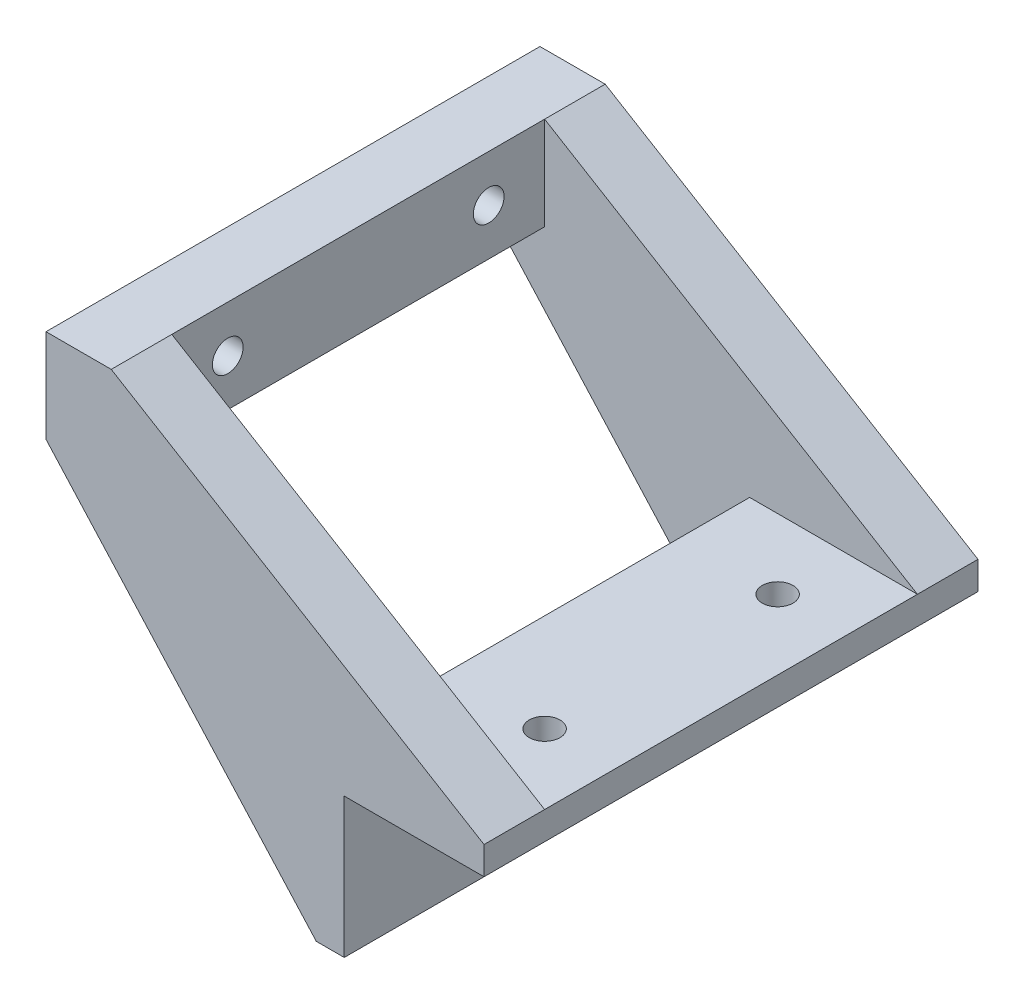
ISO-10303-21;
HEADER;
FILE_DESCRIPTION(('STEP AP214'),'2;1');
FILE_NAME('part.step','',(''),(''),'','','');
FILE_SCHEMA(('AUTOMOTIVE_DESIGN { 1 0 10303 214 1 1 1 1 }'));
ENDSEC;
DATA;
#1=APPLICATION_CONTEXT('core data for automotive mechanical design processes');
#2=APPLICATION_PROTOCOL_DEFINITION('international standard','automotive_design',2000,#1);
#3=PRODUCT_CONTEXT('',#1,'mechanical');
#4=PRODUCT('Part','Part','',(#3));
#5=PRODUCT_RELATED_PRODUCT_CATEGORY('part','',(#4));
#6=PRODUCT_DEFINITION_FORMATION('','',#4);
#7=PRODUCT_DEFINITION_CONTEXT('part definition',#1,'design');
#8=PRODUCT_DEFINITION('design','',#6,#7);
#9=PRODUCT_DEFINITION_SHAPE('','',#8);
#10=(LENGTH_UNIT() NAMED_UNIT(*) SI_UNIT(.MILLI.,.METRE.));
#11=(NAMED_UNIT(*) PLANE_ANGLE_UNIT() SI_UNIT($,.RADIAN.));
#12=(NAMED_UNIT(*) SI_UNIT($,.STERADIAN.) SOLID_ANGLE_UNIT());
#13=UNCERTAINTY_MEASURE_WITH_UNIT(LENGTH_MEASURE(1.E-05),#10,'distance_accuracy_value','');
#14=(GEOMETRIC_REPRESENTATION_CONTEXT(3) GLOBAL_UNCERTAINTY_ASSIGNED_CONTEXT((#13)) GLOBAL_UNIT_ASSIGNED_CONTEXT((#10,
#11,#12)) REPRESENTATION_CONTEXT('',''));
#15=CARTESIAN_POINT('',(0.,0.,0.));
#16=DIRECTION('',(0.,0.,1.));
#17=DIRECTION('',(1.,0.,0.));
#18=AXIS2_PLACEMENT_3D('',#15,#16,#17);
#19=CARTESIAN_POINT('',(-25.,17.15,26.5));
#20=DIRECTION('',(1.,0.,0.));
#21=DIRECTION('',(0.,1.,0.));
#22=AXIS2_PLACEMENT_3D('',#19,#20,#21);
#23=PLANE('',#22);
#24=CARTESIAN_POINT('',(-25.,22.15,14.));
#25=DIRECTION('',(-1.,0.,0.));
#26=DIRECTION('',(0.,-1.,0.));
#27=AXIS2_PLACEMENT_3D('',#24,#25,#26);
#28=CIRCLE('',#27,1.65);
#29=CARTESIAN_POINT('',(-25.,20.5,14.));
#30=VERTEX_POINT('',#29);
#31=EDGE_CURVE('E221',#30,#30,#28,.T.);
#32=ORIENTED_EDGE('',*,*,#31,.T.);
#33=EDGE_LOOP('',(#32));
#34=FACE_BOUND('',#33,.T.);
#35=CARTESIAN_POINT('',(-25.,22.15,-14.));
#36=DIRECTION('',(-1.,0.,0.));
#37=DIRECTION('',(0.,-1.,0.));
#38=AXIS2_PLACEMENT_3D('',#35,#36,#37);
#39=CIRCLE('',#38,1.65);
#40=CARTESIAN_POINT('',(-25.,20.5,-14.));
#41=VERTEX_POINT('',#40);
#42=EDGE_CURVE('E224',#41,#41,#39,.T.);
#43=ORIENTED_EDGE('',*,*,#42,.T.);
#44=EDGE_LOOP('',(#43));
#45=FACE_BOUND('',#44,.T.);
#46=DIRECTION('',(0.,1.,0.));
#47=VECTOR('',#46,1.);
#48=CARTESIAN_POINT('',(-25.,3.00000000000002,20.));
#49=LINE('',#48,#47);
#50=CARTESIAN_POINT('',(-25.,17.15,20.));
#51=VERTEX_POINT('',#50);
#52=CARTESIAN_POINT('',(-25.,27.15,20.));
#53=VERTEX_POINT('',#52);
#54=EDGE_CURVE('E237',#51,#53,#49,.T.);
#55=ORIENTED_EDGE('',*,*,#54,.F.);
#56=DIRECTION('',(0.,0.,-1.));
#57=VECTOR('',#56,1.);
#58=CARTESIAN_POINT('',(-25.,17.15,26.5));
#59=LINE('',#58,#57);
#60=CARTESIAN_POINT('',(-25.,17.15,-20.));
#61=VERTEX_POINT('',#60);
#62=EDGE_CURVE('E11',#51,#61,#59,.T.);
#63=ORIENTED_EDGE('',*,*,#62,.T.);
#64=DIRECTION('',(0.,-1.,0.));
#65=VECTOR('',#64,1.);
#66=CARTESIAN_POINT('',(-25.,3.00000000000002,-20.));
#67=LINE('',#66,#65);
#68=CARTESIAN_POINT('',(-25.,27.15,-20.));
#69=VERTEX_POINT('',#68);
#70=EDGE_CURVE('E149',#69,#61,#67,.T.);
#71=ORIENTED_EDGE('',*,*,#70,.F.);
#72=DIRECTION('',(0.,0.,-1.));
#73=VECTOR('',#72,1.);
#74=CARTESIAN_POINT('',(-25.,27.15,20.));
#75=LINE('',#74,#73);
#76=EDGE_CURVE('E243',#53,#69,#75,.T.);
#77=ORIENTED_EDGE('',*,*,#76,.F.);
#78=EDGE_LOOP('',(#55,#63,#71,#77));
#79=FACE_BOUND('',#78,.T.);
#80=ADVANCED_FACE('F38',(#34,#45,#79),#23,.T.);
#81=CARTESIAN_POINT('',(-25.,27.15,26.5));
#82=DIRECTION('',(-0.51685430248884,-0.856073378863503,0.));
#83=DIRECTION('',(0.856073378863503,-0.51685430248884,0.));
#84=AXIS2_PLACEMENT_3D('',#81,#82,#83);
#85=PLANE('',#84);
#86=DIRECTION('',(0.,0.,-1.));
#87=VECTOR('',#86,1.);
#88=CARTESIAN_POINT('',(15.,3.,26.5));
#89=LINE('',#88,#87);
#90=CARTESIAN_POINT('',(15.,3.,26.5));
#91=VERTEX_POINT('',#90);
#92=CARTESIAN_POINT('',(15.,3.,20.));
#93=VERTEX_POINT('',#92);
#94=EDGE_CURVE('E156',#91,#93,#89,.T.);
#95=ORIENTED_EDGE('',*,*,#94,.T.);
#96=DIRECTION('',(-0.856073378863503,0.51685430248884,0.));
#97=VECTOR('',#96,1.);
#98=CARTESIAN_POINT('',(-25.,27.15,20.));
#99=LINE('',#98,#97);
#100=EDGE_CURVE('E233',#93,#53,#99,.T.);
#101=ORIENTED_EDGE('',*,*,#100,.T.);
#102=DIRECTION('',(0.,0.,-1.));
#103=VECTOR('',#102,1.);
#104=CARTESIAN_POINT('',(-25.,27.15,26.5));
#105=LINE('',#104,#103);
#106=CARTESIAN_POINT('',(-25.,27.15,26.5));
#107=VERTEX_POINT('',#106);
#108=EDGE_CURVE('E162',#107,#53,#105,.T.);
#109=ORIENTED_EDGE('',*,*,#108,.F.);
#110=DIRECTION('',(-0.856073378863503,0.51685430248884,0.));
#111=VECTOR('',#110,1.);
#112=CARTESIAN_POINT('',(-25.,27.15,26.5));
#113=LINE('',#112,#111);
#114=EDGE_CURVE('E204',#91,#107,#113,.T.);
#115=ORIENTED_EDGE('',*,*,#114,.F.);
#116=EDGE_LOOP('',(#95,#101,#109,#115));
#117=FACE_BOUND('',#116,.T.);
#118=ADVANCED_FACE('F318',(#117),#85,.F.);
#119=CARTESIAN_POINT('',(15.,3.,26.5));
#120=DIRECTION('',(-1.,0.,0.));
#121=DIRECTION('',(0.,0.,1.));
#122=AXIS2_PLACEMENT_3D('',#119,#120,#121);
#123=PLANE('',#122);
#124=DIRECTION('',(0.,1.,0.));
#125=VECTOR('',#124,1.);
#126=CARTESIAN_POINT('',(15.,3.,-26.5));
#127=LINE('',#126,#125);
#128=CARTESIAN_POINT('',(15.,0.,-26.5));
#129=VERTEX_POINT('',#128);
#130=CARTESIAN_POINT('',(15.,3.,-26.5));
#131=VERTEX_POINT('',#130);
#132=EDGE_CURVE('E193',#129,#131,#127,.T.);
#133=ORIENTED_EDGE('',*,*,#132,.T.);
#134=CARTESIAN_POINT('',(15.,3.,-20.));
#135=VERTEX_POINT('',#134);
#136=EDGE_CURVE('E159',#135,#131,#89,.T.);
#137=ORIENTED_EDGE('',*,*,#136,.F.);
#138=DIRECTION('',(0.,0.,-1.));
#139=VECTOR('',#138,1.);
#140=CARTESIAN_POINT('',(15.,3.,-20.));
#141=LINE('',#140,#139);
#142=EDGE_CURVE('E241',#93,#135,#141,.T.);
#143=ORIENTED_EDGE('',*,*,#142,.F.);
#144=ORIENTED_EDGE('',*,*,#94,.F.);
#145=DIRECTION('',(0.,1.,0.));
#146=VECTOR('',#145,1.);
#147=CARTESIAN_POINT('',(15.,3.,26.5));
#148=LINE('',#147,#146);
#149=CARTESIAN_POINT('',(15.,0.,26.5));
#150=VERTEX_POINT('',#149);
#151=EDGE_CURVE('E183',#150,#91,#148,.T.);
#152=ORIENTED_EDGE('',*,*,#151,.F.);
#153=DIRECTION('',(0.,0.,-1.));
#154=VECTOR('',#153,1.);
#155=CARTESIAN_POINT('',(15.,0.,26.5));
#156=LINE('',#155,#154);
#157=EDGE_CURVE('E177',#150,#129,#156,.T.);
#158=ORIENTED_EDGE('',*,*,#157,.T.);
#159=EDGE_LOOP('',(#133,#137,#143,#144,#152,#158));
#160=FACE_BOUND('',#159,.T.);
#161=ADVANCED_FACE('F40',(#160),#123,.F.);
#162=CARTESIAN_POINT('',(-25.,27.15,-26.5));
#163=VERTEX_POINT('',#162);
#164=EDGE_CURVE('E165',#69,#163,#105,.T.);
#165=ORIENTED_EDGE('',*,*,#164,.F.);
#166=DIRECTION('',(0.856073378863503,-0.51685430248884,0.));
#167=VECTOR('',#166,1.);
#168=CARTESIAN_POINT('',(-25.,27.15,-20.));
#169=LINE('',#168,#167);
#170=EDGE_CURVE('E230',#69,#135,#169,.T.);
#171=ORIENTED_EDGE('',*,*,#170,.T.);
#172=ORIENTED_EDGE('',*,*,#136,.T.);
#173=DIRECTION('',(-0.856073378863503,0.51685430248884,0.));
#174=VECTOR('',#173,1.);
#175=CARTESIAN_POINT('',(-25.,27.15,-26.5));
#176=LINE('',#175,#174);
#177=EDGE_CURVE('E190',#131,#163,#176,.T.);
#178=ORIENTED_EDGE('',*,*,#177,.T.);
#179=EDGE_LOOP('',(#165,#171,#172,#178));
#180=FACE_BOUND('',#179,.T.);
#181=ADVANCED_FACE('F313',(#180),#85,.F.);
#182=CARTESIAN_POINT('',(-32.,17.15,26.5));
#183=DIRECTION('',(0.742547199692077,0.669793741557395,0.));
#184=DIRECTION('',(-0.669793741557395,0.742547199692077,0.));
#185=AXIS2_PLACEMENT_3D('',#182,#183,#184);
#186=PLANE('',#185);
#187=DIRECTION('',(0.,0.,-1.));
#188=VECTOR('',#187,1.);
#189=CARTESIAN_POINT('',(-3.,-15.,26.5));
#190=LINE('',#189,#188);
#191=CARTESIAN_POINT('',(-2.99999999999999,-15.,-20.));
#192=VERTEX_POINT('',#191);
#193=CARTESIAN_POINT('',(-3.,-15.,-26.5));
#194=VERTEX_POINT('',#193);
#195=EDGE_CURVE('E154',#192,#194,#190,.T.);
#196=ORIENTED_EDGE('',*,*,#195,.F.);
#197=DIRECTION('',(-0.669793741557395,0.742547199692077,0.));
#198=VECTOR('',#197,1.);
#199=CARTESIAN_POINT('',(-32.,17.15,-20.));
#200=LINE('',#199,#198);
#201=CARTESIAN_POINT('',(-28.8596344063938,13.6685257298469,-20.));
#202=VERTEX_POINT('',#201);
#203=EDGE_CURVE('E147',#192,#202,#200,.T.);
#204=ORIENTED_EDGE('',*,*,#203,.T.);
#205=DIRECTION('',(0.,0.,1.));
#206=VECTOR('',#205,1.);
#207=CARTESIAN_POINT('',(-28.8596344063938,13.6685257298469,-20.));
#208=LINE('',#207,#206);
#209=CARTESIAN_POINT('',(-28.8596344063938,13.6685257298469,20.));
#210=VERTEX_POINT('',#209);
#211=EDGE_CURVE('E137',#202,#210,#208,.T.);
#212=ORIENTED_EDGE('',*,*,#211,.T.);
#213=DIRECTION('',(0.669793741557395,-0.742547199692077,0.));
#214=VECTOR('',#213,1.);
#215=CARTESIAN_POINT('',(-32.,17.15,20.));
#216=LINE('',#215,#214);
#217=CARTESIAN_POINT('',(-3.,-15.,20.));
#218=VERTEX_POINT('',#217);
#219=EDGE_CURVE('E46',#210,#218,#216,.T.);
#220=ORIENTED_EDGE('',*,*,#219,.T.);
#221=CARTESIAN_POINT('',(-3.,-15.,26.5));
#222=VERTEX_POINT('',#221);
#223=EDGE_CURVE('E168',#222,#218,#190,.T.);
#224=ORIENTED_EDGE('',*,*,#223,.F.);
#225=DIRECTION('',(0.669793741557395,-0.742547199692077,0.));
#226=VECTOR('',#225,1.);
#227=CARTESIAN_POINT('',(-32.,17.15,26.5));
#228=LINE('',#227,#226);
#229=CARTESIAN_POINT('',(-32.,17.15,26.5));
#230=VERTEX_POINT('',#229);
#231=EDGE_CURVE('E202',#230,#222,#228,.T.);
#232=ORIENTED_EDGE('',*,*,#231,.F.);
#233=DIRECTION('',(0.,0.,-1.));
#234=VECTOR('',#233,1.);
#235=CARTESIAN_POINT('',(-32.,17.15,26.5));
#236=LINE('',#235,#234);
#237=CARTESIAN_POINT('',(-32.,17.15,-26.5));
#238=VERTEX_POINT('',#237);
#239=EDGE_CURVE('E166',#230,#238,#236,.T.);
#240=ORIENTED_EDGE('',*,*,#239,.T.);
#241=DIRECTION('',(0.669793741557395,-0.742547199692077,0.));
#242=VECTOR('',#241,1.);
#243=CARTESIAN_POINT('',(-32.,17.15,-26.5));
#244=LINE('',#243,#242);
#245=EDGE_CURVE('E188',#238,#194,#244,.T.);
#246=ORIENTED_EDGE('',*,*,#245,.T.);
#247=EDGE_LOOP('',(#196,#204,#212,#220,#224,#232,#240,#246));
#248=FACE_BOUND('',#247,.T.);
#249=ADVANCED_FACE('F152',(#248),#186,.F.);
#250=CARTESIAN_POINT('',(0.,-15.,26.5));
#251=DIRECTION('',(0.,1.,0.));
#252=DIRECTION('',(0.,0.,1.));
#253=AXIS2_PLACEMENT_3D('',#250,#251,#252);
#254=PLANE('',#253);
#255=DIRECTION('',(1.,0.,0.));
#256=VECTOR('',#255,1.);
#257=CARTESIAN_POINT('',(0.,-15.,-26.5));
#258=LINE('',#257,#256);
#259=CARTESIAN_POINT('',(0.,-15.,-26.5));
#260=VERTEX_POINT('',#259);
#261=EDGE_CURVE('E186',#194,#260,#258,.T.);
#262=ORIENTED_EDGE('',*,*,#261,.T.);
#263=DIRECTION('',(0.,0.,-1.));
#264=VECTOR('',#263,1.);
#265=CARTESIAN_POINT('',(0.,-15.,26.5));
#266=LINE('',#265,#264);
#267=CARTESIAN_POINT('',(0.,-15.,26.5));
#268=VERTEX_POINT('',#267);
#269=EDGE_CURVE('E171',#268,#260,#266,.T.);
#270=ORIENTED_EDGE('',*,*,#269,.F.);
#271=DIRECTION('',(1.,0.,0.));
#272=VECTOR('',#271,1.);
#273=CARTESIAN_POINT('',(0.,-15.,26.5));
#274=LINE('',#273,#272);
#275=EDGE_CURVE('E200',#222,#268,#274,.T.);
#276=ORIENTED_EDGE('',*,*,#275,.F.);
#277=ORIENTED_EDGE('',*,*,#223,.T.);
#278=DIRECTION('',(0.,0.,1.));
#279=VECTOR('',#278,1.);
#280=CARTESIAN_POINT('',(-3.,-15.,20.));
#281=LINE('',#280,#279);
#282=EDGE_CURVE('E255',#192,#218,#281,.T.);
#283=ORIENTED_EDGE('',*,*,#282,.F.);
#284=ORIENTED_EDGE('',*,*,#195,.T.);
#285=EDGE_LOOP('',(#262,#270,#276,#277,#283,#284));
#286=FACE_BOUND('',#285,.T.);
#287=ADVANCED_FACE('F330',(#286),#254,.F.);
#288=CARTESIAN_POINT('',(0.,0.,26.5));
#289=DIRECTION('',(-1.,0.,0.));
#290=DIRECTION('',(0.,-1.,0.));
#291=AXIS2_PLACEMENT_3D('',#288,#289,#290);
#292=PLANE('',#291);
#293=CARTESIAN_POINT('',(0.,-7.5,5.));
#294=DIRECTION('',(1.,0.,0.));
#295=DIRECTION('',(0.,1.,0.));
#296=AXIS2_PLACEMENT_3D('',#293,#294,#295);
#297=CIRCLE('',#296,1.65);
#298=CARTESIAN_POINT('',(0.,-5.85,5.));
#299=VERTEX_POINT('',#298);
#300=EDGE_CURVE('E264',#299,#299,#297,.T.);
#301=ORIENTED_EDGE('',*,*,#300,.F.);
#302=EDGE_LOOP('',(#301));
#303=FACE_BOUND('',#302,.T.);
#304=CARTESIAN_POINT('',(0.,-7.5,-5.));
#305=DIRECTION('',(1.,0.,0.));
#306=DIRECTION('',(0.,1.,0.));
#307=AXIS2_PLACEMENT_3D('',#304,#305,#306);
#308=CIRCLE('',#307,1.65);
#309=CARTESIAN_POINT('',(0.,-5.85,-5.));
#310=VERTEX_POINT('',#309);
#311=EDGE_CURVE('E265',#310,#310,#308,.T.);
#312=ORIENTED_EDGE('',*,*,#311,.F.);
#313=EDGE_LOOP('',(#312));
#314=FACE_BOUND('',#313,.T.);
#315=DIRECTION('',(0.,1.,0.));
#316=VECTOR('',#315,1.);
#317=CARTESIAN_POINT('',(0.,0.,-26.5));
#318=LINE('',#317,#316);
#319=CARTESIAN_POINT('',(0.,0.,-26.5));
#320=VERTEX_POINT('',#319);
#321=EDGE_CURVE('E184',#260,#320,#318,.T.);
#322=ORIENTED_EDGE('',*,*,#321,.T.);
#323=DIRECTION('',(0.,0.,-1.));
#324=VECTOR('',#323,1.);
#325=CARTESIAN_POINT('',(0.,0.,26.5));
#326=LINE('',#325,#324);
#327=CARTESIAN_POINT('',(0.,0.,26.5));
#328=VERTEX_POINT('',#327);
#329=EDGE_CURVE('E174',#328,#320,#326,.T.);
#330=ORIENTED_EDGE('',*,*,#329,.F.);
#331=DIRECTION('',(0.,1.,0.));
#332=VECTOR('',#331,1.);
#333=CARTESIAN_POINT('',(0.,0.,26.5));
#334=LINE('',#333,#332);
#335=EDGE_CURVE('E198',#268,#328,#334,.T.);
#336=ORIENTED_EDGE('',*,*,#335,.F.);
#337=ORIENTED_EDGE('',*,*,#269,.T.);
#338=EDGE_LOOP('',(#322,#330,#336,#337));
#339=FACE_BOUND('',#338,.T.);
#340=ADVANCED_FACE('F292',(#303,#314,#339),#292,.F.);
#341=CARTESIAN_POINT('',(15.,0.,26.5));
#342=DIRECTION('',(0.,1.,0.));
#343=DIRECTION('',(-1.,0.,0.));
#344=AXIS2_PLACEMENT_3D('',#341,#342,#343);
#345=PLANE('',#344);
#346=CARTESIAN_POINT('',(7.5,0.,12.5));
#347=DIRECTION('',(0.,-1.,0.));
#348=DIRECTION('',(1.,0.,0.));
#349=AXIS2_PLACEMENT_3D('',#346,#347,#348);
#350=CIRCLE('',#349,1.65);
#351=CARTESIAN_POINT('',(9.15,0.,12.5));
#352=VERTEX_POINT('',#351);
#353=EDGE_CURVE('E276',#352,#352,#350,.T.);
#354=ORIENTED_EDGE('',*,*,#353,.F.);
#355=EDGE_LOOP('',(#354));
#356=FACE_BOUND('',#355,.T.);
#357=CARTESIAN_POINT('',(7.5,0.,-12.5));
#358=DIRECTION('',(0.,-1.,0.));
#359=DIRECTION('',(1.,0.,0.));
#360=AXIS2_PLACEMENT_3D('',#357,#358,#359);
#361=CIRCLE('',#360,1.65);
#362=CARTESIAN_POINT('',(9.15,0.,-12.5));
#363=VERTEX_POINT('',#362);
#364=EDGE_CURVE('E277',#363,#363,#361,.T.);
#365=ORIENTED_EDGE('',*,*,#364,.F.);
#366=EDGE_LOOP('',(#365));
#367=FACE_BOUND('',#366,.T.);
#368=DIRECTION('',(1.,0.,0.));
#369=VECTOR('',#368,1.);
#370=CARTESIAN_POINT('',(15.,0.,-26.5));
#371=LINE('',#370,#369);
#372=EDGE_CURVE('E181',#320,#129,#371,.T.);
#373=ORIENTED_EDGE('',*,*,#372,.T.);
#374=ORIENTED_EDGE('',*,*,#157,.F.);
#375=DIRECTION('',(1.,0.,0.));
#376=VECTOR('',#375,1.);
#377=CARTESIAN_POINT('',(15.,0.,26.5));
#378=LINE('',#377,#376);
#379=EDGE_CURVE('E180',#328,#150,#378,.T.);
#380=ORIENTED_EDGE('',*,*,#379,.F.);
#381=ORIENTED_EDGE('',*,*,#329,.T.);
#382=EDGE_LOOP('',(#373,#374,#380,#381));
#383=FACE_BOUND('',#382,.T.);
#384=ADVANCED_FACE('F288',(#356,#367,#383),#345,.F.);
#385=CARTESIAN_POINT('',(0.,0.,26.5));
#386=DIRECTION('',(0.,0.,-1.));
#387=DIRECTION('',(-1.,0.,0.));
#388=AXIS2_PLACEMENT_3D('',#385,#386,#387);
#389=PLANE('',#388);
#390=ORIENTED_EDGE('',*,*,#151,.T.);
#391=ORIENTED_EDGE('',*,*,#114,.T.);
#392=DIRECTION('',(1.,0.,0.));
#393=VECTOR('',#392,1.);
#394=CARTESIAN_POINT('',(-32.,27.15,26.5));
#395=LINE('',#394,#393);
#396=CARTESIAN_POINT('',(-32.,27.15,26.5));
#397=VERTEX_POINT('',#396);
#398=EDGE_CURVE('E196',#397,#107,#395,.T.);
#399=ORIENTED_EDGE('',*,*,#398,.F.);
#400=DIRECTION('',(0.,1.,0.));
#401=VECTOR('',#400,1.);
#402=CARTESIAN_POINT('',(-32.,27.15,26.5));
#403=LINE('',#402,#401);
#404=EDGE_CURVE('E215',#230,#397,#403,.T.);
#405=ORIENTED_EDGE('',*,*,#404,.F.);
#406=ORIENTED_EDGE('',*,*,#231,.T.);
#407=ORIENTED_EDGE('',*,*,#275,.T.);
#408=ORIENTED_EDGE('',*,*,#335,.T.);
#409=ORIENTED_EDGE('',*,*,#379,.T.);
#410=EDGE_LOOP('',(#390,#391,#399,#405,#406,#407,#408,#409));
#411=FACE_BOUND('',#410,.T.);
#412=ADVANCED_FACE('F291',(#411),#389,.F.);
#413=CARTESIAN_POINT('',(0.,0.,-26.5));
#414=DIRECTION('',(0.,0.,-1.));
#415=DIRECTION('',(-1.,0.,0.));
#416=AXIS2_PLACEMENT_3D('',#413,#414,#415);
#417=PLANE('',#416);
#418=ORIENTED_EDGE('',*,*,#132,.F.);
#419=ORIENTED_EDGE('',*,*,#372,.F.);
#420=ORIENTED_EDGE('',*,*,#321,.F.);
#421=ORIENTED_EDGE('',*,*,#261,.F.);
#422=ORIENTED_EDGE('',*,*,#245,.F.);
#423=DIRECTION('',(0.,-1.,0.));
#424=VECTOR('',#423,1.);
#425=CARTESIAN_POINT('',(-32.,27.15,-26.5));
#426=LINE('',#425,#424);
#427=CARTESIAN_POINT('',(-32.,27.15,-26.5));
#428=VERTEX_POINT('',#427);
#429=EDGE_CURVE('E217',#428,#238,#426,.T.);
#430=ORIENTED_EDGE('',*,*,#429,.F.);
#431=DIRECTION('',(1.,0.,0.));
#432=VECTOR('',#431,1.);
#433=CARTESIAN_POINT('',(-32.,27.15,-26.5));
#434=LINE('',#433,#432);
#435=EDGE_CURVE('E210',#428,#163,#434,.T.);
#436=ORIENTED_EDGE('',*,*,#435,.T.);
#437=ORIENTED_EDGE('',*,*,#177,.F.);
#438=EDGE_LOOP('',(#418,#419,#420,#421,#422,#430,#436,#437));
#439=FACE_BOUND('',#438,.T.);
#440=ADVANCED_FACE('F308',(#439),#417,.T.);
#441=CARTESIAN_POINT('',(-32.,0.,0.));
#442=DIRECTION('',(-1.,0.,0.));
#443=DIRECTION('',(0.,-1.,0.));
#444=AXIS2_PLACEMENT_3D('',#441,#442,#443);
#445=PLANE('',#444);
#446=CARTESIAN_POINT('',(-32.,22.15,14.));
#447=DIRECTION('',(-1.,0.,0.));
#448=DIRECTION('',(0.,-1.,0.));
#449=AXIS2_PLACEMENT_3D('',#446,#447,#448);
#450=CIRCLE('',#449,1.65);
#451=CARTESIAN_POINT('',(-32.,20.5,14.));
#452=VERTEX_POINT('',#451);
#453=EDGE_CURVE('E220',#452,#452,#450,.T.);
#454=ORIENTED_EDGE('',*,*,#453,.F.);
#455=EDGE_LOOP('',(#454));
#456=FACE_BOUND('',#455,.T.);
#457=ORIENTED_EDGE('',*,*,#429,.T.);
#458=ORIENTED_EDGE('',*,*,#239,.F.);
#459=ORIENTED_EDGE('',*,*,#404,.T.);
#460=DIRECTION('',(0.,0.,-1.));
#461=VECTOR('',#460,1.);
#462=CARTESIAN_POINT('',(-32.,27.15,-26.5));
#463=LINE('',#462,#461);
#464=EDGE_CURVE('E213',#397,#428,#463,.T.);
#465=ORIENTED_EDGE('',*,*,#464,.T.);
#466=EDGE_LOOP('',(#457,#458,#459,#465));
#467=FACE_BOUND('',#466,.T.);
#468=CARTESIAN_POINT('',(-32.,22.15,-14.));
#469=DIRECTION('',(-1.,0.,0.));
#470=DIRECTION('',(0.,-1.,0.));
#471=AXIS2_PLACEMENT_3D('',#468,#469,#470);
#472=CIRCLE('',#471,1.65);
#473=CARTESIAN_POINT('',(-32.,20.5,-14.));
#474=VERTEX_POINT('',#473);
#475=EDGE_CURVE('E227',#474,#474,#472,.T.);
#476=ORIENTED_EDGE('',*,*,#475,.F.);
#477=EDGE_LOOP('',(#476));
#478=FACE_BOUND('',#477,.T.);
#479=ADVANCED_FACE('F335',(#456,#467,#478),#445,.T.);
#480=CARTESIAN_POINT('',(-32.,27.15,-26.5));
#481=DIRECTION('',(0.,-1.,0.));
#482=DIRECTION('',(1.,0.,0.));
#483=AXIS2_PLACEMENT_3D('',#480,#481,#482);
#484=PLANE('',#483);
#485=ORIENTED_EDGE('',*,*,#108,.T.);
#486=ORIENTED_EDGE('',*,*,#76,.T.);
#487=ORIENTED_EDGE('',*,*,#164,.T.);
#488=ORIENTED_EDGE('',*,*,#435,.F.);
#489=ORIENTED_EDGE('',*,*,#464,.F.);
#490=ORIENTED_EDGE('',*,*,#398,.T.);
#491=EDGE_LOOP('',(#485,#486,#487,#488,#489,#490));
#492=FACE_BOUND('',#491,.T.);
#493=ADVANCED_FACE('F339',(#492),#484,.F.);
#494=CARTESIAN_POINT('',(-32.,22.15,14.));
#495=DIRECTION('',(1.,0.,0.));
#496=DIRECTION('',(0.,1.,0.));
#497=AXIS2_PLACEMENT_3D('',#494,#495,#496);
#498=CYLINDRICAL_SURFACE('',#497,1.65);
#499=ORIENTED_EDGE('',*,*,#453,.T.);
#500=EDGE_LOOP('',(#499));
#501=FACE_BOUND('',#500,.T.);
#502=ORIENTED_EDGE('',*,*,#31,.F.);
#503=EDGE_LOOP('',(#502));
#504=FACE_BOUND('',#503,.T.);
#505=ADVANCED_FACE('F379',(#501,#504),#498,.F.);
#506=CARTESIAN_POINT('',(-32.,22.15,-14.));
#507=DIRECTION('',(1.,0.,0.));
#508=DIRECTION('',(0.,1.,0.));
#509=AXIS2_PLACEMENT_3D('',#506,#507,#508);
#510=CYLINDRICAL_SURFACE('',#509,1.65);
#511=ORIENTED_EDGE('',*,*,#475,.T.);
#512=EDGE_LOOP('',(#511));
#513=FACE_BOUND('',#512,.T.);
#514=ORIENTED_EDGE('',*,*,#42,.F.);
#515=EDGE_LOOP('',(#514));
#516=FACE_BOUND('',#515,.T.);
#517=ADVANCED_FACE('F375',(#513,#516),#510,.F.);
#518=CARTESIAN_POINT('',(-71.7249665596456,3.,-20.));
#519=DIRECTION('',(0.,-1.,0.));
#520=DIRECTION('',(0.,0.,-1.));
#521=AXIS2_PLACEMENT_3D('',#518,#519,#520);
#522=PLANE('',#521);
#523=CARTESIAN_POINT('',(7.5,3.,12.5));
#524=DIRECTION('',(0.,-1.,0.));
#525=DIRECTION('',(0.,0.,-1.));
#526=AXIS2_PLACEMENT_3D('',#523,#524,#525);
#527=CIRCLE('',#526,1.65);
#528=CARTESIAN_POINT('',(7.5,3.,10.85));
#529=VERTEX_POINT('',#528);
#530=EDGE_CURVE('E268',#529,#529,#527,.F.);
#531=ORIENTED_EDGE('',*,*,#530,.F.);
#532=EDGE_LOOP('',(#531));
#533=FACE_BOUND('',#532,.T.);
#534=CARTESIAN_POINT('',(7.5,3.,-12.5));
#535=DIRECTION('',(0.,-1.,0.));
#536=DIRECTION('',(0.,0.,-1.));
#537=AXIS2_PLACEMENT_3D('',#534,#535,#536);
#538=CIRCLE('',#537,1.65);
#539=CARTESIAN_POINT('',(7.5,3.,-14.15));
#540=VERTEX_POINT('',#539);
#541=EDGE_CURVE('E273',#540,#540,#538,.F.);
#542=ORIENTED_EDGE('',*,*,#541,.F.);
#543=EDGE_LOOP('',(#542));
#544=FACE_BOUND('',#543,.T.);
#545=DIRECTION('',(1.,0.,0.));
#546=VECTOR('',#545,1.);
#547=CARTESIAN_POINT('',(-71.7249665596456,3.,-20.));
#548=LINE('',#547,#546);
#549=CARTESIAN_POINT('',(-3.,3.,-20.));
#550=VERTEX_POINT('',#549);
#551=EDGE_CURVE('E238',#550,#135,#548,.T.);
#552=ORIENTED_EDGE('',*,*,#551,.F.);
#553=DIRECTION('',(0.,0.,1.));
#554=VECTOR('',#553,1.);
#555=CARTESIAN_POINT('',(-3.,3.,-20.));
#556=LINE('',#555,#554);
#557=CARTESIAN_POINT('',(-3.,3.,20.));
#558=VERTEX_POINT('',#557);
#559=EDGE_CURVE('E246',#550,#558,#556,.T.);
#560=ORIENTED_EDGE('',*,*,#559,.T.);
#561=DIRECTION('',(1.,0.,0.));
#562=VECTOR('',#561,1.);
#563=CARTESIAN_POINT('',(-71.7249665596456,3.,20.));
#564=LINE('',#563,#562);
#565=EDGE_CURVE('E240',#558,#93,#564,.T.);
#566=ORIENTED_EDGE('',*,*,#565,.T.);
#567=ORIENTED_EDGE('',*,*,#142,.T.);
#568=EDGE_LOOP('',(#552,#560,#566,#567));
#569=FACE_BOUND('',#568,.T.);
#570=ADVANCED_FACE('F343',(#533,#544,#569),#522,.F.);
#571=CARTESIAN_POINT('',(-71.7249665596456,3.,20.));
#572=DIRECTION('',(0.,0.,1.));
#573=DIRECTION('',(1.,0.,0.));
#574=AXIS2_PLACEMENT_3D('',#571,#572,#573);
#575=PLANE('',#574);
#576=ORIENTED_EDGE('',*,*,#219,.F.);
#577=DIRECTION('',(-0.742547199692077,-0.669793741557395,0.));
#578=VECTOR('',#577,1.);
#579=CARTESIAN_POINT('',(10.3470067521794,49.0337696987,20.));
#580=LINE('',#579,#578);
#581=EDGE_CURVE('E140',#51,#210,#580,.T.);
#582=ORIENTED_EDGE('',*,*,#581,.F.);
#583=ORIENTED_EDGE('',*,*,#54,.T.);
#584=ORIENTED_EDGE('',*,*,#100,.F.);
#585=ORIENTED_EDGE('',*,*,#565,.F.);
#586=DIRECTION('',(0.,-1.,0.));
#587=VECTOR('',#586,1.);
#588=CARTESIAN_POINT('',(-3.,17.15,20.));
#589=LINE('',#588,#587);
#590=EDGE_CURVE('E253',#558,#218,#589,.T.);
#591=ORIENTED_EDGE('',*,*,#590,.T.);
#592=EDGE_LOOP('',(#576,#582,#583,#584,#585,#591));
#593=FACE_BOUND('',#592,.T.);
#594=ADVANCED_FACE('F347',(#593),#575,.F.);
#595=CARTESIAN_POINT('',(-71.7249665596456,3.,-20.));
#596=DIRECTION('',(0.,0.,-1.));
#597=DIRECTION('',(-1.,0.,0.));
#598=AXIS2_PLACEMENT_3D('',#595,#596,#597);
#599=PLANE('',#598);
#600=ORIENTED_EDGE('',*,*,#70,.T.);
#601=DIRECTION('',(-0.742547199692077,-0.669793741557395,0.));
#602=VECTOR('',#601,1.);
#603=CARTESIAN_POINT('',(10.3470067521794,49.0337696987,-20.));
#604=LINE('',#603,#602);
#605=EDGE_CURVE('E61',#61,#202,#604,.T.);
#606=ORIENTED_EDGE('',*,*,#605,.T.);
#607=ORIENTED_EDGE('',*,*,#203,.F.);
#608=DIRECTION('',(0.,-1.,0.));
#609=VECTOR('',#608,1.);
#610=CARTESIAN_POINT('',(-2.99999999999999,17.15,-20.));
#611=LINE('',#610,#609);
#612=EDGE_CURVE('E53',#550,#192,#611,.T.);
#613=ORIENTED_EDGE('',*,*,#612,.F.);
#614=ORIENTED_EDGE('',*,*,#551,.T.);
#615=ORIENTED_EDGE('',*,*,#170,.F.);
#616=EDGE_LOOP('',(#600,#606,#607,#613,#614,#615));
#617=FACE_BOUND('',#616,.T.);
#618=ADVANCED_FACE('F146',(#617),#599,.F.);
#619=CARTESIAN_POINT('',(-3.,17.15,20.));
#620=DIRECTION('',(1.,0.,0.));
#621=DIRECTION('',(0.,0.,-1.));
#622=AXIS2_PLACEMENT_3D('',#619,#620,#621);
#623=PLANE('',#622);
#624=CARTESIAN_POINT('',(-3.,-7.5,5.));
#625=DIRECTION('',(1.,0.,0.));
#626=DIRECTION('',(0.,0.,-1.));
#627=AXIS2_PLACEMENT_3D('',#624,#625,#626);
#628=CIRCLE('',#627,1.65);
#629=CARTESIAN_POINT('',(-3.,-7.5,3.35));
#630=VERTEX_POINT('',#629);
#631=EDGE_CURVE('E260',#630,#630,#628,.F.);
#632=ORIENTED_EDGE('',*,*,#631,.F.);
#633=EDGE_LOOP('',(#632));
#634=FACE_BOUND('',#633,.T.);
#635=CARTESIAN_POINT('',(-3.,-7.5,-5.));
#636=DIRECTION('',(1.,0.,0.));
#637=DIRECTION('',(0.,0.,-1.));
#638=AXIS2_PLACEMENT_3D('',#635,#636,#637);
#639=CIRCLE('',#638,1.65);
#640=CARTESIAN_POINT('',(-3.,-7.5,-6.65));
#641=VERTEX_POINT('',#640);
#642=EDGE_CURVE('E261',#641,#641,#639,.F.);
#643=ORIENTED_EDGE('',*,*,#642,.F.);
#644=EDGE_LOOP('',(#643));
#645=FACE_BOUND('',#644,.T.);
#646=ORIENTED_EDGE('',*,*,#612,.T.);
#647=ORIENTED_EDGE('',*,*,#282,.T.);
#648=ORIENTED_EDGE('',*,*,#590,.F.);
#649=ORIENTED_EDGE('',*,*,#559,.F.);
#650=EDGE_LOOP('',(#646,#647,#648,#649));
#651=FACE_BOUND('',#650,.T.);
#652=ADVANCED_FACE('F348',(#634,#645,#651),#623,.F.);
#653=CARTESIAN_POINT('',(-7.66690475583121,-7.5,-5.));
#654=DIRECTION('',(1.,0.,0.));
#655=DIRECTION('',(0.,1.,0.));
#656=AXIS2_PLACEMENT_3D('',#653,#654,#655);
#657=CYLINDRICAL_SURFACE('',#656,1.65);
#658=ORIENTED_EDGE('',*,*,#642,.T.);
#659=EDGE_LOOP('',(#658));
#660=FACE_BOUND('',#659,.T.);
#661=ORIENTED_EDGE('',*,*,#311,.T.);
#662=EDGE_LOOP('',(#661));
#663=FACE_BOUND('',#662,.T.);
#664=ADVANCED_FACE('F350',(#660,#663),#657,.F.);
#665=CARTESIAN_POINT('',(-7.66690475583121,-7.5,5.));
#666=DIRECTION('',(1.,0.,0.));
#667=DIRECTION('',(0.,1.,0.));
#668=AXIS2_PLACEMENT_3D('',#665,#666,#667);
#669=CYLINDRICAL_SURFACE('',#668,1.65);
#670=ORIENTED_EDGE('',*,*,#631,.T.);
#671=EDGE_LOOP('',(#670));
#672=FACE_BOUND('',#671,.T.);
#673=ORIENTED_EDGE('',*,*,#300,.T.);
#674=EDGE_LOOP('',(#673));
#675=FACE_BOUND('',#674,.T.);
#676=ADVANCED_FACE('F357',(#672,#675),#669,.F.);
#677=CARTESIAN_POINT('',(7.5,7.66690475583122,-12.5));
#678=DIRECTION('',(0.,-1.,0.));
#679=DIRECTION('',(1.,0.,0.));
#680=AXIS2_PLACEMENT_3D('',#677,#678,#679);
#681=CYLINDRICAL_SURFACE('',#680,1.65);
#682=ORIENTED_EDGE('',*,*,#541,.T.);
#683=EDGE_LOOP('',(#682));
#684=FACE_BOUND('',#683,.T.);
#685=ORIENTED_EDGE('',*,*,#364,.T.);
#686=EDGE_LOOP('',(#685));
#687=FACE_BOUND('',#686,.T.);
#688=ADVANCED_FACE('F453',(#684,#687),#681,.F.);
#689=CARTESIAN_POINT('',(7.5,7.66690475583122,12.5));
#690=DIRECTION('',(0.,-1.,0.));
#691=DIRECTION('',(1.,0.,0.));
#692=AXIS2_PLACEMENT_3D('',#689,#690,#691);
#693=CYLINDRICAL_SURFACE('',#692,1.65);
#694=ORIENTED_EDGE('',*,*,#530,.T.);
#695=EDGE_LOOP('',(#694));
#696=FACE_BOUND('',#695,.T.);
#697=ORIENTED_EDGE('',*,*,#353,.T.);
#698=EDGE_LOOP('',(#697));
#699=FACE_BOUND('',#698,.T.);
#700=ADVANCED_FACE('F286',(#696,#699),#693,.F.);
#701=CARTESIAN_POINT('',(10.3470067521794,49.0337696987,-20.));
#702=DIRECTION('',(0.669793741557395,-0.742547199692077,0.));
#703=DIRECTION('',(0.742547199692077,0.669793741557395,0.));
#704=AXIS2_PLACEMENT_3D('',#701,#702,#703);
#705=PLANE('',#704);
#706=ORIENTED_EDGE('',*,*,#62,.F.);
#707=ORIENTED_EDGE('',*,*,#581,.T.);
#708=ORIENTED_EDGE('',*,*,#211,.F.);
#709=ORIENTED_EDGE('',*,*,#605,.F.);
#710=EDGE_LOOP('',(#706,#707,#708,#709));
#711=FACE_BOUND('',#710,.T.);
#712=ADVANCED_FACE('F138',(#711),#705,.T.);
#713=CLOSED_SHELL('',(#80,#118,#161,#181,#249,#287,#340,#384,#412,#440,#479,#493,#505,#517,#570,
#594,#618,#652,#664,#676,#688,#700,#712));
#714=MANIFOLD_SOLID_BREP('B2',#713);
#715=ADVANCED_BREP_SHAPE_REPRESENTATION('',(#18,#714),#14);
#716=SHAPE_DEFINITION_REPRESENTATION(#9,#715);
ENDSEC;
END-ISO-10303-21;
